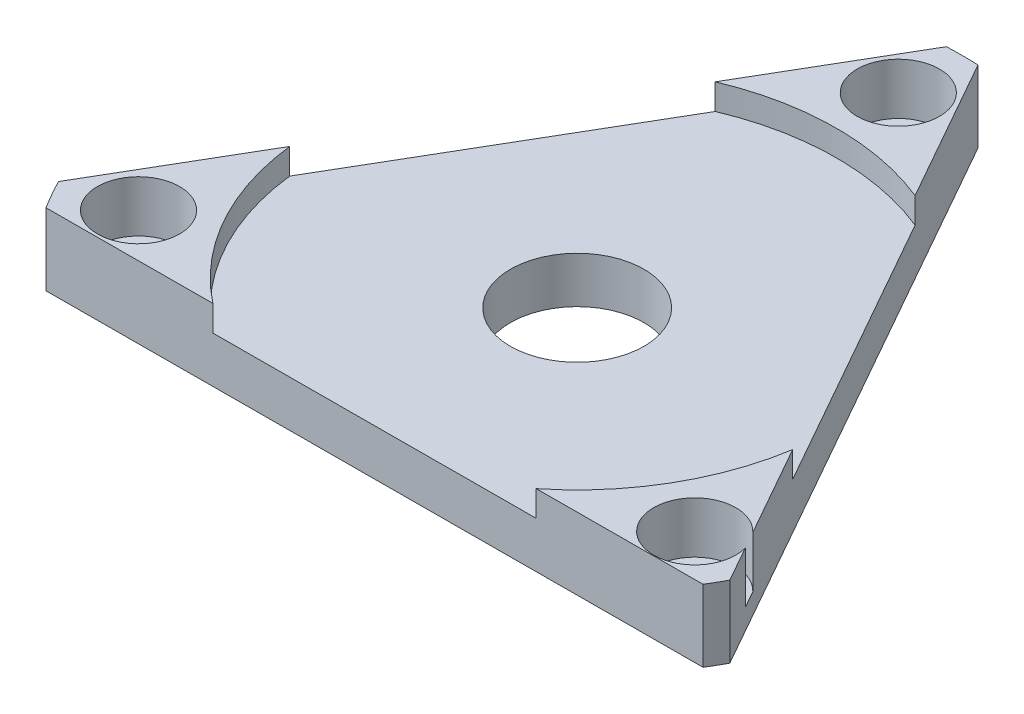
ISO-10303-21;
HEADER;
FILE_DESCRIPTION(('STEP AP214'),'2;1');
FILE_NAME('part.step','',(''),(''),'','','');
FILE_SCHEMA(('AUTOMOTIVE_DESIGN { 1 0 10303 214 1 1 1 1 }'));
ENDSEC;
DATA;
#1=APPLICATION_CONTEXT('core data for automotive mechanical design processes');
#2=APPLICATION_PROTOCOL_DEFINITION('international standard','automotive_design',2000,#1);
#3=PRODUCT_CONTEXT('',#1,'mechanical');
#4=PRODUCT('Part','Part','',(#3));
#5=PRODUCT_RELATED_PRODUCT_CATEGORY('part','',(#4));
#6=PRODUCT_DEFINITION_FORMATION('','',#4);
#7=PRODUCT_DEFINITION_CONTEXT('part definition',#1,'design');
#8=PRODUCT_DEFINITION('design','',#6,#7);
#9=PRODUCT_DEFINITION_SHAPE('','',#8);
#10=(LENGTH_UNIT() NAMED_UNIT(*) SI_UNIT(.MILLI.,.METRE.));
#11=(NAMED_UNIT(*) PLANE_ANGLE_UNIT() SI_UNIT($,.RADIAN.));
#12=(NAMED_UNIT(*) SI_UNIT($,.STERADIAN.) SOLID_ANGLE_UNIT());
#13=UNCERTAINTY_MEASURE_WITH_UNIT(LENGTH_MEASURE(1.E-05),#10,'distance_accuracy_value','');
#14=(GEOMETRIC_REPRESENTATION_CONTEXT(3) GLOBAL_UNCERTAINTY_ASSIGNED_CONTEXT((#13)) GLOBAL_UNIT_ASSIGNED_CONTEXT((#10,
#11,#12)) REPRESENTATION_CONTEXT('',''));
#15=CARTESIAN_POINT('',(0.,0.,0.));
#16=DIRECTION('',(0.,0.,1.));
#17=DIRECTION('',(1.,0.,0.));
#18=AXIS2_PLACEMENT_3D('',#15,#16,#17);
#19=CARTESIAN_POINT('',(0.,14.,0.));
#20=DIRECTION('',(0.,-1.,0.));
#21=DIRECTION('',(0.,0.,-1.));
#22=AXIS2_PLACEMENT_3D('',#19,#20,#21);
#23=CYLINDRICAL_SURFACE('',#22,75.);
#24=CARTESIAN_POINT('',(0.,14.,0.));
#25=DIRECTION('',(0.,1.,0.));
#26=DIRECTION('',(0.,0.,1.));
#27=AXIS2_PLACEMENT_3D('',#24,#25,#26);
#28=CIRCLE('',#27,75.);
#29=CARTESIAN_POINT('',(3.07302686767452,14.,-74.9370169266869));
#30=VERTEX_POINT('',#29);
#31=CARTESIAN_POINT('',(-3.07302686766589,14.,-74.9370169266872));
#32=VERTEX_POINT('',#31);
#33=EDGE_CURVE('E174',#30,#32,#28,.T.);
#34=ORIENTED_EDGE('',*,*,#33,.F.);
#35=DIRECTION('',(0.,-1.,0.));
#36=VECTOR('',#35,1.);
#37=CARTESIAN_POINT('',(3.07302686767452,17.,-74.9370169266869));
#38=LINE('',#37,#36);
#39=CARTESIAN_POINT('',(3.07302686767452,0.,-74.9370169266869));
#40=VERTEX_POINT('',#39);
#41=EDGE_CURVE('E158',#30,#40,#38,.T.);
#42=ORIENTED_EDGE('',*,*,#41,.T.);
#43=CARTESIAN_POINT('',(0.,0.,0.));
#44=DIRECTION('',(0.,1.,0.));
#45=DIRECTION('',(0.,0.,1.));
#46=AXIS2_PLACEMENT_3D('',#43,#44,#45);
#47=CIRCLE('',#46,75.);
#48=CARTESIAN_POINT('',(-3.07302686766589,0.,-74.9370169266872));
#49=VERTEX_POINT('',#48);
#50=EDGE_CURVE('E162',#40,#49,#47,.T.);
#51=ORIENTED_EDGE('',*,*,#50,.T.);
#52=DIRECTION('',(0.,-1.,0.));
#53=VECTOR('',#52,1.);
#54=CARTESIAN_POINT('',(-3.07302686766589,17.,-74.9370169266872));
#55=LINE('',#54,#53);
#56=EDGE_CURVE('E302',#32,#49,#55,.T.);
#57=ORIENTED_EDGE('',*,*,#56,.F.);
#58=EDGE_LOOP('',(#34,#42,#51,#57));
#59=FACE_BOUND('',#58,.T.);
#60=ADVANCED_FACE('F36',(#59),#23,.T.);
#61=CARTESIAN_POINT('',(63.846861252916,0.,39.3519797234002));
#62=VERTEX_POINT('',#61);
#63=CARTESIAN_POINT('',(65.762802754264,0.,36.0590317937651));
#64=VERTEX_POINT('',#63);
#65=EDGE_CURVE('E157',#62,#64,#47,.T.);
#66=ORIENTED_EDGE('',*,*,#65,.T.);
#67=DIRECTION('',(0.,-1.,0.));
#68=VECTOR('',#67,1.);
#69=CARTESIAN_POINT('',(65.762802754264,17.,36.0590317937651));
#70=LINE('',#69,#68);
#71=CARTESIAN_POINT('',(65.762802754264,14.,36.0590317937651));
#72=VERTEX_POINT('',#71);
#73=EDGE_CURVE('E556',#72,#64,#70,.T.);
#74=ORIENTED_EDGE('',*,*,#73,.F.);
#75=CARTESIAN_POINT('',(63.846861252916,14.,39.3519797234002));
#76=VERTEX_POINT('',#75);
#77=EDGE_CURVE('E175',#76,#72,#28,.T.);
#78=ORIENTED_EDGE('',*,*,#77,.F.);
#79=DIRECTION('',(0.,-1.,0.));
#80=VECTOR('',#79,1.);
#81=CARTESIAN_POINT('',(63.846861252916,17.,39.3519797234002));
#82=LINE('',#81,#80);
#83=EDGE_CURVE('E146',#76,#62,#82,.T.);
#84=ORIENTED_EDGE('',*,*,#83,.T.);
#85=EDGE_LOOP('',(#66,#74,#78,#84));
#86=FACE_BOUND('',#85,.T.);
#87=ADVANCED_FACE('F331',(#86),#23,.T.);
#88=CARTESIAN_POINT('',(0.,14.,0.));
#89=DIRECTION('',(0.,1.,0.));
#90=DIRECTION('',(0.,0.,1.));
#91=AXIS2_PLACEMENT_3D('',#88,#89,#90);
#92=PLANE('',#91);
#93=DIRECTION('',(0.491777082684444,0.,0.870721138451558));
#94=VECTOR('',#93,1.);
#95=CARTESIAN_POINT('',(34.4179148109693,14.,-19.4389925664609));
#96=LINE('',#95,#94);
#97=CARTESIAN_POINT('',(18.9618476604106,14.,-46.8048964671794));
#98=VERTEX_POINT('',#97);
#99=EDGE_CURVE('E293',#30,#98,#96,.T.);
#100=ORIENTED_EDGE('',*,*,#99,.F.);
#101=ORIENTED_EDGE('',*,*,#33,.T.);
#102=DIRECTION('',(0.503975889205033,0.,-0.863717721886032));
#103=VECTOR('',#102,1.);
#104=CARTESIAN_POINT('',(-34.9120554920841,14.,-20.3710468880714));
#105=LINE('',#104,#103);
#106=CARTESIAN_POINT('',(-19.655490554221,14.,-46.5178642144384));
#107=VERTEX_POINT('',#106);
#108=EDGE_CURVE('E271',#107,#32,#105,.T.);
#109=ORIENTED_EDGE('',*,*,#108,.F.);
#110=CARTESIAN_POINT('',(0.,14.,0.));
#111=DIRECTION('',(0.,1.,0.));
#112=DIRECTION('',(0.,0.,1.));
#113=AXIS2_PLACEMENT_3D('',#110,#111,#112);
#114=CIRCLE('',#113,50.5);
#115=EDGE_CURVE('E214',#98,#107,#114,.T.);
#116=ORIENTED_EDGE('',*,*,#115,.F.);
#117=EDGE_LOOP('',(#100,#101,#109,#116));
#118=FACE_BOUND('',#117,.T.);
#119=CARTESIAN_POINT('',(0.,14.,-62.5));
#120=DIRECTION('',(0.,1.,0.));
#121=DIRECTION('',(0.,0.,1.));
#122=AXIS2_PLACEMENT_3D('',#119,#120,#121);
#123=CIRCLE('',#122,8.);
#124=CARTESIAN_POINT('',(0.,14.,-54.5));
#125=VERTEX_POINT('',#124);
#126=EDGE_CURVE('E243',#125,#125,#123,.T.);
#127=ORIENTED_EDGE('',*,*,#126,.F.);
#128=EDGE_LOOP('',(#127));
#129=FACE_BOUND('',#128,.T.);
#130=ADVANCED_FACE('F275',(#118,#129),#92,.T.);
#131=CARTESIAN_POINT('',(49.873981961528,14.,7.92691133425763));
#132=VERTEX_POINT('',#131);
#133=CARTESIAN_POINT('',(59.9466835524451,14.,25.7612401497667));
#134=VERTEX_POINT('',#133);
#135=EDGE_CURVE('E212',#132,#134,#96,.T.);
#136=ORIENTED_EDGE('',*,*,#135,.F.);
#137=CARTESIAN_POINT('',(31.4952898836783,14.,39.475267132004));
#138=VERTEX_POINT('',#137);
#139=EDGE_CURVE('E206',#138,#132,#114,.T.);
#140=ORIENTED_EDGE('',*,*,#139,.F.);
#141=DIRECTION('',(-0.999992738740419,0.,0.00381083539883786));
#142=VECTOR('',#141,1.);
#143=CARTESIAN_POINT('',(0.150890042317007,14.,39.5947163478265));
#144=LINE('',#143,#142);
#145=EDGE_CURVE('E59',#76,#138,#144,.T.);
#146=ORIENTED_EDGE('',*,*,#145,.F.);
#147=ORIENTED_EDGE('',*,*,#77,.T.);
#148=CARTESIAN_POINT('',(61.8321465445851,14.,29.0995666819079));
#149=VERTEX_POINT('',#148);
#150=EDGE_CURVE('E290',#149,#72,#96,.T.);
#151=ORIENTED_EDGE('',*,*,#150,.F.);
#152=CARTESIAN_POINT('',(54.1265877365273,14.,31.2500000000003));
#153=DIRECTION('',(0.,1.,0.));
#154=DIRECTION('',(0.,0.,1.));
#155=AXIS2_PLACEMENT_3D('',#152,#153,#154);
#156=CIRCLE('',#155,8.);
#157=EDGE_CURVE('E250',#134,#149,#156,.T.);
#158=ORIENTED_EDGE('',*,*,#157,.F.);
#159=EDGE_LOOP('',(#136,#140,#146,#147,#151,#158));
#160=FACE_BOUND('',#159,.T.);
#161=ADVANCED_FACE('F211',(#160),#92,.T.);
#162=CARTESIAN_POINT('',(0.,9.,0.));
#163=DIRECTION('',(0.,1.,0.));
#164=DIRECTION('',(0.,0.,1.));
#165=AXIS2_PLACEMENT_3D('',#162,#163,#164);
#166=CYLINDRICAL_SURFACE('',#165,50.5);
#167=ORIENTED_EDGE('',*,*,#139,.T.);
#168=DIRECTION('',(0.,1.,0.));
#169=VECTOR('',#168,1.);
#170=CARTESIAN_POINT('',(49.873981961528,9.,7.92691133425763));
#171=LINE('',#170,#169);
#172=CARTESIAN_POINT('',(49.873981961528,9.,7.92691133425763));
#173=VERTEX_POINT('',#172);
#174=EDGE_CURVE('E294',#132,#173,#171,.F.);
#175=ORIENTED_EDGE('',*,*,#174,.T.);
#176=CARTESIAN_POINT('',(0.,9.,0.));
#177=DIRECTION('',(0.,1.,0.));
#178=DIRECTION('',(0.,0.,1.));
#179=AXIS2_PLACEMENT_3D('',#176,#177,#178);
#180=CIRCLE('',#179,50.5);
#181=CARTESIAN_POINT('',(31.4952898836783,9.,39.475267132004));
#182=VERTEX_POINT('',#181);
#183=EDGE_CURVE('E208',#182,#173,#180,.T.);
#184=ORIENTED_EDGE('',*,*,#183,.F.);
#185=DIRECTION('',(0.,1.,0.));
#186=VECTOR('',#185,1.);
#187=CARTESIAN_POINT('',(31.4952898836783,9.,39.475267132004));
#188=LINE('',#187,#186);
#189=EDGE_CURVE('E44',#182,#138,#188,.T.);
#190=ORIENTED_EDGE('',*,*,#189,.T.);
#191=EDGE_LOOP('',(#167,#175,#184,#190));
#192=FACE_BOUND('',#191,.T.);
#193=ADVANCED_FACE('F204',(#192),#166,.F.);
#194=CARTESIAN_POINT('',(-50.1686204299471,14.,5.77577043829565));
#195=VERTEX_POINT('',#194);
#196=CARTESIAN_POINT('',(-31.1935097990443,14.,39.7141655636491));
#197=VERTEX_POINT('',#196);
#198=EDGE_CURVE('E216',#195,#197,#114,.T.);
#199=ORIENTED_EDGE('',*,*,#198,.T.);
#200=DIRECTION('',(0.,1.,0.));
#201=VECTOR('',#200,1.);
#202=CARTESIAN_POINT('',(-31.1935097990443,9.,39.7141655636491));
#203=LINE('',#202,#201);
#204=CARTESIAN_POINT('',(-31.1935097990443,9.,39.7141655636491));
#205=VERTEX_POINT('',#204);
#206=EDGE_CURVE('E11',#197,#205,#203,.F.);
#207=ORIENTED_EDGE('',*,*,#206,.T.);
#208=CARTESIAN_POINT('',(-50.1686204299471,9.,5.77577043829565));
#209=VERTEX_POINT('',#208);
#210=EDGE_CURVE('E213',#209,#205,#180,.T.);
#211=ORIENTED_EDGE('',*,*,#210,.F.);
#212=DIRECTION('',(0.,1.,0.));
#213=VECTOR('',#212,1.);
#214=CARTESIAN_POINT('',(-50.1686204299471,9.,5.77577043829565));
#215=LINE('',#214,#213);
#216=EDGE_CURVE('E191',#209,#195,#215,.T.);
#217=ORIENTED_EDGE('',*,*,#216,.T.);
#218=EDGE_LOOP('',(#199,#207,#211,#217));
#219=FACE_BOUND('',#218,.T.);
#220=ADVANCED_FACE('F317',(#219),#166,.F.);
#221=CARTESIAN_POINT('',(54.1265877365273,0.,31.2500000000003));
#222=DIRECTION('',(0.,1.,0.));
#223=DIRECTION('',(0.,0.,1.));
#224=AXIS2_PLACEMENT_3D('',#221,#222,#223);
#225=CYLINDRICAL_SURFACE('',#224,5.);
#226=CARTESIAN_POINT('',(54.1265877365273,0.,31.2500000000003));
#227=DIRECTION('',(0.,1.,0.));
#228=DIRECTION('',(0.,0.,1.));
#229=AXIS2_PLACEMENT_3D('',#226,#227,#228);
#230=CIRCLE('',#229,5.);
#231=CARTESIAN_POINT('',(54.1265877365273,0.,36.2500000000003));
#232=VERTEX_POINT('',#231);
#233=EDGE_CURVE('E167',#232,#232,#230,.T.);
#234=ORIENTED_EDGE('',*,*,#233,.F.);
#235=EDGE_LOOP('',(#234));
#236=FACE_BOUND('',#235,.T.);
#237=CARTESIAN_POINT('',(54.1265877365273,4.,31.2500000000003));
#238=DIRECTION('',(0.,1.,0.));
#239=DIRECTION('',(0.,0.,1.));
#240=AXIS2_PLACEMENT_3D('',#237,#238,#239);
#241=CIRCLE('',#240,5.);
#242=CARTESIAN_POINT('',(54.1265877365273,4.,36.2500000000003));
#243=VERTEX_POINT('',#242);
#244=EDGE_CURVE('E194',#243,#243,#241,.F.);
#245=ORIENTED_EDGE('',*,*,#244,.F.);
#246=EDGE_LOOP('',(#245));
#247=FACE_BOUND('',#246,.T.);
#248=ADVANCED_FACE('F314',(#236,#247),#225,.F.);
#249=CARTESIAN_POINT('',(0.,0.,-62.5));
#250=DIRECTION('',(0.,1.,0.));
#251=DIRECTION('',(0.,0.,1.));
#252=AXIS2_PLACEMENT_3D('',#249,#250,#251);
#253=CYLINDRICAL_SURFACE('',#252,5.);
#254=CARTESIAN_POINT('',(0.,0.,-62.5));
#255=DIRECTION('',(0.,1.,0.));
#256=DIRECTION('',(0.,0.,1.));
#257=AXIS2_PLACEMENT_3D('',#254,#255,#256);
#258=CIRCLE('',#257,5.);
#259=CARTESIAN_POINT('',(0.,0.,-57.5));
#260=VERTEX_POINT('',#259);
#261=EDGE_CURVE('E163',#260,#260,#258,.T.);
#262=ORIENTED_EDGE('',*,*,#261,.F.);
#263=EDGE_LOOP('',(#262));
#264=FACE_BOUND('',#263,.T.);
#265=CARTESIAN_POINT('',(0.,4.,-62.5));
#266=DIRECTION('',(0.,1.,0.));
#267=DIRECTION('',(0.,0.,1.));
#268=AXIS2_PLACEMENT_3D('',#265,#266,#267);
#269=CIRCLE('',#268,5.);
#270=CARTESIAN_POINT('',(0.,4.,-57.5));
#271=VERTEX_POINT('',#270);
#272=EDGE_CURVE('E235',#271,#271,#269,.F.);
#273=ORIENTED_EDGE('',*,*,#272,.F.);
#274=EDGE_LOOP('',(#273));
#275=FACE_BOUND('',#274,.T.);
#276=ADVANCED_FACE('F316',(#264,#275),#253,.F.);
#277=CARTESIAN_POINT('',(-54.1265877365273,0.,31.2500000000003));
#278=DIRECTION('',(0.,1.,0.));
#279=DIRECTION('',(0.,0.,1.));
#280=AXIS2_PLACEMENT_3D('',#277,#278,#279);
#281=CYLINDRICAL_SURFACE('',#280,4.99999999999999);
#282=CARTESIAN_POINT('',(-54.1265877365273,0.,31.2500000000003));
#283=DIRECTION('',(0.,1.,0.));
#284=DIRECTION('',(0.,0.,1.));
#285=AXIS2_PLACEMENT_3D('',#282,#283,#284);
#286=CIRCLE('',#285,4.99999999999999);
#287=CARTESIAN_POINT('',(-54.1265877365273,0.,36.2500000000003));
#288=VERTEX_POINT('',#287);
#289=EDGE_CURVE('E540',#288,#288,#286,.T.);
#290=ORIENTED_EDGE('',*,*,#289,.F.);
#291=EDGE_LOOP('',(#290));
#292=FACE_BOUND('',#291,.T.);
#293=CARTESIAN_POINT('',(-54.1265877365273,4.,31.2500000000003));
#294=DIRECTION('',(0.,1.,0.));
#295=DIRECTION('',(0.,0.,1.));
#296=AXIS2_PLACEMENT_3D('',#293,#294,#295);
#297=CIRCLE('',#296,4.99999999999999);
#298=CARTESIAN_POINT('',(-54.1265877365273,4.,36.2500000000003));
#299=VERTEX_POINT('',#298);
#300=EDGE_CURVE('E223',#299,#299,#297,.F.);
#301=ORIENTED_EDGE('',*,*,#300,.F.);
#302=EDGE_LOOP('',(#301));
#303=FACE_BOUND('',#302,.T.);
#304=ADVANCED_FACE('F324',(#292,#303),#281,.F.);
#305=CARTESIAN_POINT('',(0.,0.,0.));
#306=DIRECTION('',(0.,1.,0.));
#307=DIRECTION('',(0.,0.,1.));
#308=AXIS2_PLACEMENT_3D('',#305,#306,#307);
#309=CYLINDRICAL_SURFACE('',#308,13.);
#310=CARTESIAN_POINT('',(0.,0.,0.));
#311=DIRECTION('',(0.,1.,0.));
#312=DIRECTION('',(0.,0.,1.));
#313=AXIS2_PLACEMENT_3D('',#310,#311,#312);
#314=CIRCLE('',#313,13.);
#315=CARTESIAN_POINT('',(0.,0.,13.));
#316=VERTEX_POINT('',#315);
#317=EDGE_CURVE('E255',#316,#316,#314,.T.);
#318=ORIENTED_EDGE('',*,*,#317,.F.);
#319=EDGE_LOOP('',(#318));
#320=FACE_BOUND('',#319,.T.);
#321=CARTESIAN_POINT('',(0.,9.,0.));
#322=DIRECTION('',(0.,1.,0.));
#323=DIRECTION('',(0.,0.,1.));
#324=AXIS2_PLACEMENT_3D('',#321,#322,#323);
#325=CIRCLE('',#324,13.);
#326=CARTESIAN_POINT('',(0.,9.,13.));
#327=VERTEX_POINT('',#326);
#328=EDGE_CURVE('E234',#327,#327,#325,.F.);
#329=ORIENTED_EDGE('',*,*,#328,.F.);
#330=EDGE_LOOP('',(#329));
#331=FACE_BOUND('',#330,.T.);
#332=ADVANCED_FACE('F337',(#320,#331),#309,.F.);
#333=CARTESIAN_POINT('',(-66.7510841165023,0.,34.1949231505445));
#334=VERTEX_POINT('',#333);
#335=CARTESIAN_POINT('',(-63.5450811682819,0.,39.8374529722529));
#336=VERTEX_POINT('',#335);
#337=EDGE_CURVE('E154',#334,#336,#47,.T.);
#338=ORIENTED_EDGE('',*,*,#337,.T.);
#339=DIRECTION('',(0.,-1.,0.));
#340=VECTOR('',#339,1.);
#341=CARTESIAN_POINT('',(-63.5450811682819,17.,39.8374529722529));
#342=LINE('',#341,#340);
#343=CARTESIAN_POINT('',(-63.5450811682819,14.,39.8374529722529));
#344=VERTEX_POINT('',#343);
#345=EDGE_CURVE('E135',#344,#336,#342,.T.);
#346=ORIENTED_EDGE('',*,*,#345,.F.);
#347=CARTESIAN_POINT('',(-66.7510841165023,14.,34.1949231505445));
#348=VERTEX_POINT('',#347);
#349=EDGE_CURVE('E171',#348,#344,#28,.T.);
#350=ORIENTED_EDGE('',*,*,#349,.F.);
#351=DIRECTION('',(0.,-1.,0.));
#352=VECTOR('',#351,1.);
#353=CARTESIAN_POINT('',(-66.7510841165023,17.,34.1949231505445));
#354=LINE('',#353,#352);
#355=EDGE_CURVE('E161',#348,#334,#354,.T.);
#356=ORIENTED_EDGE('',*,*,#355,.T.);
#357=EDGE_LOOP('',(#338,#346,#350,#356));
#358=FACE_BOUND('',#357,.T.);
#359=ADVANCED_FACE('F38',(#358),#23,.T.);
#360=EDGE_CURVE('E141',#197,#344,#144,.T.);
#361=ORIENTED_EDGE('',*,*,#360,.F.);
#362=ORIENTED_EDGE('',*,*,#198,.F.);
#363=EDGE_CURVE('E51',#348,#195,#105,.T.);
#364=ORIENTED_EDGE('',*,*,#363,.F.);
#365=ORIENTED_EDGE('',*,*,#349,.T.);
#366=EDGE_LOOP('',(#361,#362,#364,#365));
#367=FACE_BOUND('',#366,.T.);
#368=CARTESIAN_POINT('',(-54.1265877365273,14.,31.2500000000003));
#369=DIRECTION('',(0.,1.,0.));
#370=DIRECTION('',(0.,0.,1.));
#371=AXIS2_PLACEMENT_3D('',#368,#369,#370);
#372=CIRCLE('',#371,8.);
#373=CARTESIAN_POINT('',(-54.1265877365273,14.,39.2500000000003));
#374=VERTEX_POINT('',#373);
#375=EDGE_CURVE('E232',#374,#374,#372,.T.);
#376=ORIENTED_EDGE('',*,*,#375,.F.);
#377=EDGE_LOOP('',(#376));
#378=FACE_BOUND('',#377,.T.);
#379=ADVANCED_FACE('F336',(#367,#378),#92,.T.);
#380=CARTESIAN_POINT('',(0.,0.,0.));
#381=DIRECTION('',(0.,1.,0.));
#382=DIRECTION('',(0.,0.,1.));
#383=AXIS2_PLACEMENT_3D('',#380,#381,#382);
#384=PLANE('',#383);
#385=ORIENTED_EDGE('',*,*,#317,.T.);
#386=EDGE_LOOP('',(#385));
#387=FACE_BOUND('',#386,.T.);
#388=ORIENTED_EDGE('',*,*,#289,.T.);
#389=EDGE_LOOP('',(#388));
#390=FACE_BOUND('',#389,.T.);
#391=ORIENTED_EDGE('',*,*,#233,.T.);
#392=EDGE_LOOP('',(#391));
#393=FACE_BOUND('',#392,.T.);
#394=ORIENTED_EDGE('',*,*,#261,.T.);
#395=EDGE_LOOP('',(#394));
#396=FACE_BOUND('',#395,.T.);
#397=ORIENTED_EDGE('',*,*,#50,.F.);
#398=DIRECTION('',(-0.491777082684444,0.,-0.870721138451558));
#399=VECTOR('',#398,1.);
#400=CARTESIAN_POINT('',(34.4179148109693,0.,-19.4389925664609));
#401=LINE('',#400,#399);
#402=EDGE_CURVE('E558',#64,#40,#401,.T.);
#403=ORIENTED_EDGE('',*,*,#402,.F.);
#404=ORIENTED_EDGE('',*,*,#65,.F.);
#405=DIRECTION('',(0.999992738740418,0.,-0.00381083539883786));
#406=VECTOR('',#405,1.);
#407=CARTESIAN_POINT('',(0.150890042317007,0.,39.5947163478265));
#408=LINE('',#407,#406);
#409=EDGE_CURVE('E138',#336,#62,#408,.T.);
#410=ORIENTED_EDGE('',*,*,#409,.F.);
#411=ORIENTED_EDGE('',*,*,#337,.F.);
#412=DIRECTION('',(-0.503975889205033,0.,0.863717721886031));
#413=VECTOR('',#412,1.);
#414=CARTESIAN_POINT('',(-34.9120554920841,0.,-20.3710468880714));
#415=LINE('',#414,#413);
#416=EDGE_CURVE('E303',#49,#334,#415,.T.);
#417=ORIENTED_EDGE('',*,*,#416,.F.);
#418=EDGE_LOOP('',(#397,#403,#404,#410,#411,#417));
#419=FACE_BOUND('',#418,.T.);
#420=ADVANCED_FACE('F152',(#387,#390,#393,#396,#419),#384,.F.);
#421=CARTESIAN_POINT('',(0.,9.,0.));
#422=DIRECTION('',(0.,1.,0.));
#423=DIRECTION('',(0.,0.,1.));
#424=AXIS2_PLACEMENT_3D('',#421,#422,#423);
#425=PLANE('',#424);
#426=DIRECTION('',(0.491777082684444,0.,0.870721138451558));
#427=VECTOR('',#426,1.);
#428=CARTESIAN_POINT('',(34.4179148109693,9.,-19.4389925664609));
#429=LINE('',#428,#427);
#430=CARTESIAN_POINT('',(18.9618476604106,9.,-46.8048964671794));
#431=VERTEX_POINT('',#430);
#432=EDGE_CURVE('E263',#431,#173,#429,.T.);
#433=ORIENTED_EDGE('',*,*,#432,.F.);
#434=CARTESIAN_POINT('',(-19.655490554221,9.,-46.5178642144384));
#435=VERTEX_POINT('',#434);
#436=EDGE_CURVE('E218',#431,#435,#180,.T.);
#437=ORIENTED_EDGE('',*,*,#436,.T.);
#438=DIRECTION('',(0.503975889205033,0.,-0.863717721886032));
#439=VECTOR('',#438,1.);
#440=CARTESIAN_POINT('',(-34.9120554920841,9.,-20.3710468880714));
#441=LINE('',#440,#439);
#442=EDGE_CURVE('E261',#209,#435,#441,.T.);
#443=ORIENTED_EDGE('',*,*,#442,.F.);
#444=ORIENTED_EDGE('',*,*,#210,.T.);
#445=DIRECTION('',(-0.999992738740419,0.,0.00381083539883786));
#446=VECTOR('',#445,1.);
#447=CARTESIAN_POINT('',(0.150890042317007,9.,39.5947163478265));
#448=LINE('',#447,#446);
#449=EDGE_CURVE('E278',#182,#205,#448,.T.);
#450=ORIENTED_EDGE('',*,*,#449,.F.);
#451=ORIENTED_EDGE('',*,*,#183,.T.);
#452=EDGE_LOOP('',(#433,#437,#443,#444,#450,#451));
#453=FACE_BOUND('',#452,.T.);
#454=ORIENTED_EDGE('',*,*,#328,.T.);
#455=EDGE_LOOP('',(#454));
#456=FACE_BOUND('',#455,.T.);
#457=ADVANCED_FACE('F259',(#453,#456),#425,.T.);
#458=ORIENTED_EDGE('',*,*,#436,.F.);
#459=DIRECTION('',(0.,1.,0.));
#460=VECTOR('',#459,1.);
#461=CARTESIAN_POINT('',(18.9618476604106,9.,-46.8048964671794));
#462=LINE('',#461,#460);
#463=EDGE_CURVE('E267',#431,#98,#462,.T.);
#464=ORIENTED_EDGE('',*,*,#463,.T.);
#465=ORIENTED_EDGE('',*,*,#115,.T.);
#466=DIRECTION('',(0.,1.,0.));
#467=VECTOR('',#466,1.);
#468=CARTESIAN_POINT('',(-19.655490554221,9.,-46.5178642144384));
#469=LINE('',#468,#467);
#470=EDGE_CURVE('E198',#107,#435,#469,.F.);
#471=ORIENTED_EDGE('',*,*,#470,.T.);
#472=EDGE_LOOP('',(#458,#464,#465,#471));
#473=FACE_BOUND('',#472,.T.);
#474=ADVANCED_FACE('F266',(#473),#166,.F.);
#475=CARTESIAN_POINT('',(-54.1265877365273,4.,31.2500000000003));
#476=DIRECTION('',(0.,1.,0.));
#477=DIRECTION('',(0.,0.,1.));
#478=AXIS2_PLACEMENT_3D('',#475,#476,#477);
#479=PLANE('',#478);
#480=CARTESIAN_POINT('',(-54.1265877365273,4.,31.2500000000003));
#481=DIRECTION('',(0.,1.,0.));
#482=DIRECTION('',(0.,0.,1.));
#483=AXIS2_PLACEMENT_3D('',#480,#481,#482);
#484=CIRCLE('',#483,8.);
#485=CARTESIAN_POINT('',(-54.1265877365273,4.,39.2500000000003));
#486=VERTEX_POINT('',#485);
#487=EDGE_CURVE('E227',#486,#486,#484,.T.);
#488=ORIENTED_EDGE('',*,*,#487,.T.);
#489=EDGE_LOOP('',(#488));
#490=FACE_BOUND('',#489,.T.);
#491=ORIENTED_EDGE('',*,*,#300,.T.);
#492=EDGE_LOOP('',(#491));
#493=FACE_BOUND('',#492,.T.);
#494=ADVANCED_FACE('F353',(#490,#493),#479,.T.);
#495=CARTESIAN_POINT('',(-54.1265877365273,4.,31.2500000000003));
#496=DIRECTION('',(0.,1.,0.));
#497=DIRECTION('',(0.,0.,1.));
#498=AXIS2_PLACEMENT_3D('',#495,#496,#497);
#499=CYLINDRICAL_SURFACE('',#498,8.);
#500=ORIENTED_EDGE('',*,*,#487,.F.);
#501=EDGE_LOOP('',(#500));
#502=FACE_BOUND('',#501,.T.);
#503=ORIENTED_EDGE('',*,*,#375,.T.);
#504=EDGE_LOOP('',(#503));
#505=FACE_BOUND('',#504,.T.);
#506=ADVANCED_FACE('F356',(#502,#505),#499,.F.);
#507=CARTESIAN_POINT('',(0.,4.,-62.5));
#508=DIRECTION('',(0.,1.,0.));
#509=DIRECTION('',(0.,0.,1.));
#510=AXIS2_PLACEMENT_3D('',#507,#508,#509);
#511=PLANE('',#510);
#512=CARTESIAN_POINT('',(0.,4.,-62.5));
#513=DIRECTION('',(0.,1.,0.));
#514=DIRECTION('',(0.,0.,1.));
#515=AXIS2_PLACEMENT_3D('',#512,#513,#514);
#516=CIRCLE('',#515,8.);
#517=CARTESIAN_POINT('',(0.,4.,-54.5));
#518=VERTEX_POINT('',#517);
#519=EDGE_CURVE('E237',#518,#518,#516,.T.);
#520=ORIENTED_EDGE('',*,*,#519,.T.);
#521=EDGE_LOOP('',(#520));
#522=FACE_BOUND('',#521,.T.);
#523=ORIENTED_EDGE('',*,*,#272,.T.);
#524=EDGE_LOOP('',(#523));
#525=FACE_BOUND('',#524,.T.);
#526=ADVANCED_FACE('F359',(#522,#525),#511,.T.);
#527=CARTESIAN_POINT('',(0.,4.,-62.5));
#528=DIRECTION('',(0.,1.,0.));
#529=DIRECTION('',(0.,0.,1.));
#530=AXIS2_PLACEMENT_3D('',#527,#528,#529);
#531=CYLINDRICAL_SURFACE('',#530,8.);
#532=ORIENTED_EDGE('',*,*,#519,.F.);
#533=EDGE_LOOP('',(#532));
#534=FACE_BOUND('',#533,.T.);
#535=ORIENTED_EDGE('',*,*,#126,.T.);
#536=EDGE_LOOP('',(#535));
#537=FACE_BOUND('',#536,.T.);
#538=ADVANCED_FACE('F310',(#534,#537),#531,.F.);
#539=CARTESIAN_POINT('',(54.1265877365273,4.,31.2500000000003));
#540=DIRECTION('',(0.,1.,0.));
#541=DIRECTION('',(0.,0.,1.));
#542=AXIS2_PLACEMENT_3D('',#539,#540,#541);
#543=PLANE('',#542);
#544=DIRECTION('',(0.491777082684444,0.,0.870721138451558));
#545=VECTOR('',#544,1.);
#546=CARTESIAN_POINT('',(60.8894150485151,4.,27.4304034158373));
#547=LINE('',#546,#545);
#548=CARTESIAN_POINT('',(59.9466835524451,4.,25.7612401497667));
#549=VERTEX_POINT('',#548);
#550=CARTESIAN_POINT('',(61.8321465445851,4.,29.0995666819079));
#551=VERTEX_POINT('',#550);
#552=EDGE_CURVE('E298',#549,#551,#547,.T.);
#553=ORIENTED_EDGE('',*,*,#552,.F.);
#554=CARTESIAN_POINT('',(54.1265877365273,4.,31.2500000000003));
#555=DIRECTION('',(0.,1.,0.));
#556=DIRECTION('',(0.,0.,1.));
#557=AXIS2_PLACEMENT_3D('',#554,#555,#556);
#558=CIRCLE('',#557,8.);
#559=EDGE_CURVE('E284',#549,#551,#558,.T.);
#560=ORIENTED_EDGE('',*,*,#559,.T.);
#561=EDGE_LOOP('',(#553,#560));
#562=FACE_BOUND('',#561,.T.);
#563=ORIENTED_EDGE('',*,*,#244,.T.);
#564=EDGE_LOOP('',(#563));
#565=FACE_BOUND('',#564,.T.);
#566=ADVANCED_FACE('F307',(#562,#565),#543,.T.);
#567=CARTESIAN_POINT('',(54.1265877365273,4.,31.2500000000003));
#568=DIRECTION('',(0.,1.,0.));
#569=DIRECTION('',(0.,0.,1.));
#570=AXIS2_PLACEMENT_3D('',#567,#568,#569);
#571=CYLINDRICAL_SURFACE('',#570,8.);
#572=ORIENTED_EDGE('',*,*,#157,.T.);
#573=DIRECTION('',(0.,1.,0.));
#574=VECTOR('',#573,1.);
#575=CARTESIAN_POINT('',(61.8321465445851,4.,29.0995666819079));
#576=LINE('',#575,#574);
#577=EDGE_CURVE('E184',#149,#551,#576,.F.);
#578=ORIENTED_EDGE('',*,*,#577,.T.);
#579=ORIENTED_EDGE('',*,*,#559,.F.);
#580=DIRECTION('',(0.,1.,0.));
#581=VECTOR('',#580,1.);
#582=CARTESIAN_POINT('',(59.9466835524451,4.,25.7612401497667));
#583=LINE('',#582,#581);
#584=EDGE_CURVE('E179',#549,#134,#583,.T.);
#585=ORIENTED_EDGE('',*,*,#584,.T.);
#586=EDGE_LOOP('',(#572,#578,#579,#585));
#587=FACE_BOUND('',#586,.T.);
#588=ADVANCED_FACE('F289',(#587),#571,.F.);
#589=CARTESIAN_POINT('',(34.4179148109693,17.,-19.4389925664609));
#590=DIRECTION('',(-0.870721138451558,0.,0.491777082684444));
#591=DIRECTION('',(0.491777082684444,0.,0.870721138451558));
#592=AXIS2_PLACEMENT_3D('',#589,#590,#591);
#593=PLANE('',#592);
#594=ORIENTED_EDGE('',*,*,#99,.T.);
#595=ORIENTED_EDGE('',*,*,#463,.F.);
#596=ORIENTED_EDGE('',*,*,#432,.T.);
#597=ORIENTED_EDGE('',*,*,#174,.F.);
#598=ORIENTED_EDGE('',*,*,#135,.T.);
#599=ORIENTED_EDGE('',*,*,#584,.F.);
#600=ORIENTED_EDGE('',*,*,#552,.T.);
#601=ORIENTED_EDGE('',*,*,#577,.F.);
#602=ORIENTED_EDGE('',*,*,#150,.T.);
#603=ORIENTED_EDGE('',*,*,#73,.T.);
#604=ORIENTED_EDGE('',*,*,#402,.T.);
#605=ORIENTED_EDGE('',*,*,#41,.F.);
#606=EDGE_LOOP('',(#594,#595,#596,#597,#598,#599,#600,#601,#602,#603,#604,#605));
#607=FACE_BOUND('',#606,.T.);
#608=ADVANCED_FACE('F299',(#607),#593,.F.);
#609=CARTESIAN_POINT('',(-34.9120554920841,17.,-20.3710468880714));
#610=DIRECTION('',(0.863717721886031,0.,0.503975889205033));
#611=DIRECTION('',(0.503975889205033,0.,-0.863717721886032));
#612=AXIS2_PLACEMENT_3D('',#609,#610,#611);
#613=PLANE('',#612);
#614=ORIENTED_EDGE('',*,*,#108,.T.);
#615=ORIENTED_EDGE('',*,*,#56,.T.);
#616=ORIENTED_EDGE('',*,*,#416,.T.);
#617=ORIENTED_EDGE('',*,*,#355,.F.);
#618=ORIENTED_EDGE('',*,*,#363,.T.);
#619=ORIENTED_EDGE('',*,*,#216,.F.);
#620=ORIENTED_EDGE('',*,*,#442,.T.);
#621=ORIENTED_EDGE('',*,*,#470,.F.);
#622=EDGE_LOOP('',(#614,#615,#616,#617,#618,#619,#620,#621));
#623=FACE_BOUND('',#622,.T.);
#624=ADVANCED_FACE('F270',(#623),#613,.F.);
#625=CARTESIAN_POINT('',(0.150890042317007,17.,39.5947163478265));
#626=DIRECTION('',(-0.00381083539883786,0.,-0.999992738740419));
#627=DIRECTION('',(-0.999992738740419,0.,0.00381083539883786));
#628=AXIS2_PLACEMENT_3D('',#625,#626,#627);
#629=PLANE('',#628);
#630=ORIENTED_EDGE('',*,*,#360,.T.);
#631=ORIENTED_EDGE('',*,*,#345,.T.);
#632=ORIENTED_EDGE('',*,*,#409,.T.);
#633=ORIENTED_EDGE('',*,*,#83,.F.);
#634=ORIENTED_EDGE('',*,*,#145,.T.);
#635=ORIENTED_EDGE('',*,*,#189,.F.);
#636=ORIENTED_EDGE('',*,*,#449,.T.);
#637=ORIENTED_EDGE('',*,*,#206,.F.);
#638=EDGE_LOOP('',(#630,#631,#632,#633,#634,#635,#636,#637));
#639=FACE_BOUND('',#638,.T.);
#640=ADVANCED_FACE('F137',(#639),#629,.F.);
#641=CLOSED_SHELL('',(#60,#87,#130,#161,#193,#220,#248,#276,#304,#332,#359,#379,#420,#457,#474,
#494,#506,#526,#538,#566,#588,#608,#624,#640));
#642=MANIFOLD_SOLID_BREP('B2',#641);
#643=ADVANCED_BREP_SHAPE_REPRESENTATION('',(#18,#642),#14);
#644=SHAPE_DEFINITION_REPRESENTATION(#9,#643);
ENDSEC;
END-ISO-10303-21;
